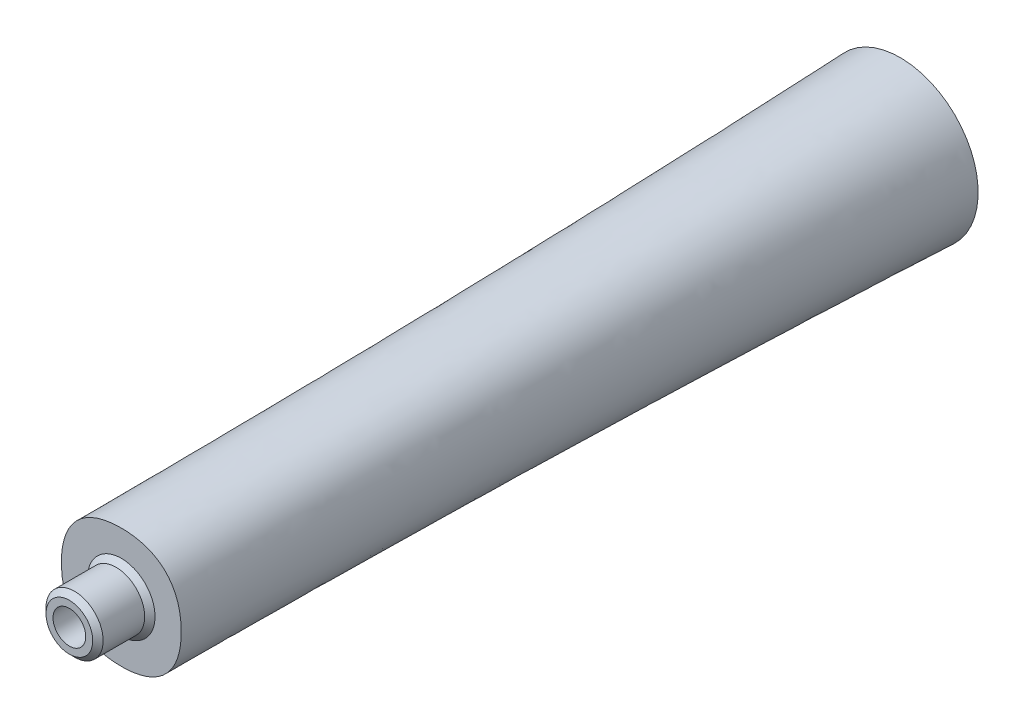
ISO-10303-21;
HEADER;
FILE_DESCRIPTION(('STEP AP214'),'2;1');
FILE_NAME('part.step','',(''),(''),'','','');
FILE_SCHEMA(('AUTOMOTIVE_DESIGN { 1 0 10303 214 1 1 1 1 }'));
ENDSEC;
DATA;
#1=APPLICATION_CONTEXT('core data for automotive mechanical design processes');
#2=APPLICATION_PROTOCOL_DEFINITION('international standard','automotive_design',2000,#1);
#3=PRODUCT_CONTEXT('',#1,'mechanical');
#4=PRODUCT('Part','Part','',(#3));
#5=PRODUCT_RELATED_PRODUCT_CATEGORY('part','',(#4));
#6=PRODUCT_DEFINITION_FORMATION('','',#4);
#7=PRODUCT_DEFINITION_CONTEXT('part definition',#1,'design');
#8=PRODUCT_DEFINITION('design','',#6,#7);
#9=PRODUCT_DEFINITION_SHAPE('','',#8);
#10=(LENGTH_UNIT() NAMED_UNIT(*) SI_UNIT(.MILLI.,.METRE.));
#11=(NAMED_UNIT(*) PLANE_ANGLE_UNIT() SI_UNIT($,.RADIAN.));
#12=(NAMED_UNIT(*) SI_UNIT($,.STERADIAN.) SOLID_ANGLE_UNIT());
#13=UNCERTAINTY_MEASURE_WITH_UNIT(LENGTH_MEASURE(1.E-05),#10,'distance_accuracy_value','');
#14=(GEOMETRIC_REPRESENTATION_CONTEXT(3) GLOBAL_UNCERTAINTY_ASSIGNED_CONTEXT((#13)) GLOBAL_UNIT_ASSIGNED_CONTEXT((#10,
#11,#12)) REPRESENTATION_CONTEXT('',''));
#15=CARTESIAN_POINT('',(0.,0.,0.));
#16=DIRECTION('',(0.,0.,1.));
#17=DIRECTION('',(1.,0.,0.));
#18=AXIS2_PLACEMENT_3D('',#15,#16,#17);
#19=CARTESIAN_POINT('',(0.,0.,150.));
#20=DIRECTION('',(0.,0.,-1.));
#21=DIRECTION('',(-1.,0.,0.));
#22=AXIS2_PLACEMENT_3D('',#19,#20,#21);
#23=PLANE('',#22);
#24=CARTESIAN_POINT('',(0.,0.,150.));
#25=DIRECTION('',(0.,0.,-1.));
#26=DIRECTION('',(-1.,0.,0.));
#27=AXIS2_PLACEMENT_3D('',#24,#25,#26);
#28=CIRCLE('',#27,6.50000000000001);
#29=CARTESIAN_POINT('',(-6.50000000000001,0.,150.));
#30=VERTEX_POINT('',#29);
#31=EDGE_CURVE('E124',#30,#30,#28,.T.);
#32=ORIENTED_EDGE('',*,*,#31,.T.);
#33=EDGE_LOOP('',(#32));
#34=FACE_BOUND('',#33,.T.);
#35=CARTESIAN_POINT('',(-11.541854565399,0.,149.999999997366));
#36=CARTESIAN_POINT('',(-11.5418536994029,-0.401355757927279,149.999999997418));
#37=CARTESIAN_POINT('',(-11.5293171598583,-0.802707549844226,149.999999999308));
#38=CARTESIAN_POINT('',(-11.4759797494714,-1.60374827617522,150.000000000692));
#39=CARTESIAN_POINT('',(-11.4351710584041,-2.00343671971828,150.000000000185));
#40=CARTESIAN_POINT('',(-11.3216394636897,-2.79775464109179,149.999999999815));
#41=CARTESIAN_POINT('',(-11.2489631262335,-3.19239063899266,149.999999999951));
#42=CARTESIAN_POINT('',(-11.0675723921283,-3.97326288959729,150.000000000049));
#43=CARTESIAN_POINT('',(-10.9588815423036,-4.3595044553448,150.000000000011));
#44=CARTESIAN_POINT('',(-10.7427202803528,-4.9960152801339,149.999999999993));
#45=CARTESIAN_POINT('',(-10.6461388384174,-5.25000013290062,149.999999999998));
#46=CARTESIAN_POINT('',(-10.4337811359734,-5.74984283685569,150.000000000002));
#47=CARTESIAN_POINT('',(-10.3180063908867,-5.99570132783038,150.000000000001));
#48=CARTESIAN_POINT('',(-10.0670053989865,-6.47705937535507,149.999999999999));
#49=CARTESIAN_POINT('',(-9.93179509497459,-6.7125672176856,150.));
#50=CARTESIAN_POINT('',(-9.64184809256927,-7.17122321615265,150.));
#51=CARTESIAN_POINT('',(-9.48711373000722,-7.39437284622081,150.));
#52=CARTESIAN_POINT('',(-9.15750136454443,-7.82742626969343,150.));
#53=CARTESIAN_POINT('',(-8.98251048976429,-8.03724465529183,150.));
#54=CARTESIAN_POINT('',(-8.70624921174298,-8.33924259631013,150.));
#55=CARTESIAN_POINT('',(-8.61186139999785,-8.43779142263712,150.));
#56=CARTESIAN_POINT('',(-8.41861810790369,-8.63045563928594,150.));
#57=CARTESIAN_POINT('',(-8.31976153520119,-8.72456993401321,150.));
#58=CARTESIAN_POINT('',(-8.01694953836434,-8.99991540051646,150.));
#59=CARTESIAN_POINT('',(-7.80665548691768,-9.17425435822067,150.));
#60=CARTESIAN_POINT('',(-7.37135617607085,-9.50359091828676,150.));
#61=CARTESIAN_POINT('',(-7.14634422384303,-9.65857962680361,150.));
#62=CARTESIAN_POINT('',(-6.69943566151898,-9.93904040360528,150.));
#63=CARTESIAN_POINT('',(-6.47834083793555,-10.0657944834204,150.));
#64=CARTESIAN_POINT('',(-6.02714425227574,-10.3021158197794,150.));
#65=CARTESIAN_POINT('',(-5.79704152776197,-10.4116812335259,150.));
#66=CARTESIAN_POINT('',(-5.32949709872402,-10.6139244558501,150.));
#67=CARTESIAN_POINT('',(-5.09205384947439,-10.706598681194,150.));
#68=CARTESIAN_POINT('',(-4.61139683146734,-10.8755182315322,150.));
#69=CARTESIAN_POINT('',(-4.36818243831409,-10.9517617697655,150.));
#70=CARTESIAN_POINT('',(-3.85608072140049,-11.0948547700045,150.));
#71=CARTESIAN_POINT('',(-3.58680439864019,-11.1603048950958,150.));
#72=CARTESIAN_POINT('',(-3.04460955998237,-11.2744817469932,150.));
#73=CARTESIAN_POINT('',(-2.7716890747401,-11.3231990169402,150.));
#74=CARTESIAN_POINT('',(-2.22348281409539,-11.4052379600946,150.));
#75=CARTESIAN_POINT('',(-1.94819632371092,-11.438554799978,150.));
#76=CARTESIAN_POINT('',(-1.39522105679997,-11.4911397562973,150.));
#77=CARTESIAN_POINT('',(-1.11752709620361,-11.5103524478534,150.));
#78=CARTESIAN_POINT('',(-0.561639275551755,-11.5356687296765,150.));
#79=CARTESIAN_POINT('',(-0.283445582040061,-11.5417760846317,150.));
#80=CARTESIAN_POINT('',(0.27291832299971,-11.5419316056286,150.));
#81=CARTESIAN_POINT('',(0.551088535015663,-11.5359802173951,150.));
#82=CARTESIAN_POINT('',(1.19691351920611,-11.5069535016099,150.));
#83=CARTESIAN_POINT('',(1.5643781536077,-11.4789574123874,150.));
#84=CARTESIAN_POINT('',(2.11335862067173,-11.4177369408435,150.));
#85=CARTESIAN_POINT('',(2.29597764410096,-11.3941266519661,150.));
#86=CARTESIAN_POINT('',(2.66026578396025,-11.3401093531148,150.));
#87=CARTESIAN_POINT('',(2.84193454474969,-11.3096999621338,150.));
#88=CARTESIAN_POINT('',(3.38325932982941,-11.2079976696009,150.));
#89=CARTESIAN_POINT('',(3.74103471936672,-11.126038003588,150.));
#90=CARTESIAN_POINT('',(4.27101276853864,-10.9793388933274,150.));
#91=CARTESIAN_POINT('',(4.44656941455521,-10.9264749427759,150.));
#92=CARTESIAN_POINT('',(4.79494128732353,-10.8123963566293,150.));
#93=CARTESIAN_POINT('',(4.96775680415604,-10.7511826113244,150.));
#94=CARTESIAN_POINT('',(5.38993427533975,-10.5895650277931,150.));
#95=CARTESIAN_POINT('',(5.6374193009443,-10.4841956906733,150.));
#96=CARTESIAN_POINT('',(6.12341250542991,-10.2544514992782,150.));
#97=CARTESIAN_POINT('',(6.36192097243637,-10.1300772556629,150.));
#98=CARTESIAN_POINT('',(6.82800416506739,-9.86205990721202,150.));
#99=CARTESIAN_POINT('',(7.05557508095503,-9.71841015350808,150.));
#100=CARTESIAN_POINT('',(7.4974461259936,-9.4121108784702,150.));
#101=CARTESIAN_POINT('',(7.71175147278949,-9.24946890079687,150.));
#102=CARTESIAN_POINT('',(8.12599163537684,-8.90497731547193,150.));
#103=CARTESIAN_POINT('',(8.3258575398975,-8.72304467129187,150.));
#104=CARTESIAN_POINT('',(8.70814352515308,-8.34169043576707,150.));
#105=CARTESIAN_POINT('',(8.8905635988201,-8.14226883733702,150.));
#106=CARTESIAN_POINT('',(9.23674385474077,-7.72802588603659,150.));
#107=CARTESIAN_POINT('',(9.40051264724978,-7.51321171428797,150.));
#108=CARTESIAN_POINT('',(9.70893085192531,-7.07015279729179,150.));
#109=CARTESIAN_POINT('',(9.85357159024528,-6.84190202639231,150.));
#110=CARTESIAN_POINT('',(10.1164781421454,-6.38634269968815,150.));
#111=CARTESIAN_POINT('',(10.2357208863338,-6.15959543283219,150.));
#112=CARTESIAN_POINT('',(10.4569568876952,-5.69783055025263,150.));
#113=CARTESIAN_POINT('',(10.5589483802222,-5.46281209142829,150.));
#114=CARTESIAN_POINT('',(10.746093058012,-4.98598753217331,150.));
#115=CARTESIAN_POINT('',(10.8312335848246,-4.74417648368212,150.));
#116=CARTESIAN_POINT('',(10.9853598858867,-4.25547375680911,150.));
#117=CARTESIAN_POINT('',(11.0543442917362,-4.00858164999423,150.));
#118=CARTESIAN_POINT('',(11.1855243746252,-3.47793919286741,150.));
#119=CARTESIAN_POINT('',(11.2455882293671,-3.19366391267622,150.));
#120=CARTESIAN_POINT('',(11.3480841507545,-2.62182048256758,150.));
#121=CARTESIAN_POINT('',(11.3905054022288,-2.3342504235514,150.));
#122=CARTESIAN_POINT('',(11.4592057307189,-1.75706364773313,150.));
#123=CARTESIAN_POINT('',(11.4854770915521,-1.46744601937061,150.));
#124=CARTESIAN_POINT('',(11.5138155244204,-1.03189790564804,150.));
#125=CARTESIAN_POINT('',(11.5214200732818,-0.886300436970029,150.));
#126=CARTESIAN_POINT('',(11.533061955762,-0.594958534543804,150.));
#127=CARTESIAN_POINT('',(11.5370992532269,-0.449214099321083,150.));
#128=CARTESIAN_POINT('',(11.5417747295487,-0.157730273853745,150.));
#129=CARTESIAN_POINT('',(11.5424142602128,-0.0119909046745823,150.));
#130=CARTESIAN_POINT('',(11.5403610855083,0.279460748718199,150.));
#131=CARTESIAN_POINT('',(11.5376684101048,0.425173033163593,150.));
#132=CARTESIAN_POINT('',(11.5243364586219,0.862094505077408,150.));
#133=CARTESIAN_POINT('',(11.5084445767624,1.15316341010471,150.));
#134=CARTESIAN_POINT('',(11.4571778167239,1.78609261947361,150.));
#135=CARTESIAN_POINT('',(11.4188251726858,2.12772037606876,150.));
#136=CARTESIAN_POINT('',(11.3185176534011,2.80751977078997,150.));
#137=CARTESIAN_POINT('',(11.2565641974387,3.14569161548904,150.));
#138=CARTESIAN_POINT('',(11.1067334330443,3.81490275391266,150.));
#139=CARTESIAN_POINT('',(11.0189655890046,4.14596595631763,150.));
#140=CARTESIAN_POINT('',(10.8658383274791,4.63574459366194,150.));
#141=CARTESIAN_POINT('',(10.8112199494759,4.79786011791878,150.));
#142=CARTESIAN_POINT('',(10.6945243358615,5.11941766533972,150.));
#143=CARTESIAN_POINT('',(10.6324459631435,5.27885927669496,150.));
#144=CARTESIAN_POINT('',(10.4639957180397,5.68253189543206,150.));
#145=CARTESIAN_POINT('',(10.3522096413007,5.92453324930647,150.));
#146=CARTESIAN_POINT('',(10.1098492399233,6.39894785918335,150.));
#147=CARTESIAN_POINT('',(9.97927532680361,6.63136132505039,150.));
#148=CARTESIAN_POINT('',(9.69919397361224,7.08469894019758,150.));
#149=CARTESIAN_POINT('',(9.54967556483482,7.30561632796521,150.));
#150=CARTESIAN_POINT('',(9.23212465099859,7.73363753372576,150.));
#151=CARTESIAN_POINT('',(9.06410076682816,7.94074771230781,150.));
#152=CARTESIAN_POINT('',(8.79848324532445,8.23989583016644,150.));
#153=CARTESIAN_POINT('',(8.70749661383106,8.33786554693269,150.));
#154=CARTESIAN_POINT('',(8.52119653991513,8.52959727617441,150.));
#155=CARTESIAN_POINT('',(8.42588318165068,8.62335937042083,150.));
#156=CARTESIAN_POINT('',(8.13375639123133,8.89806006473028,150.));
#157=CARTESIAN_POINT('',(7.9307188639717,9.07245516430253,150.));
#158=CARTESIAN_POINT('',(7.51031133305755,9.40264067152794,150.));
#159=CARTESIAN_POINT('',(7.292949803326,9.55844192842484,150.));
#160=CARTESIAN_POINT('',(6.84576339722231,9.85119968558504,150.));
#161=CARTESIAN_POINT('',(6.61593299105821,9.9881477278517,150.));
#162=CARTESIAN_POINT('',(6.15446671413528,10.2384694135765,150.));
#163=CARTESIAN_POINT('',(5.92319300005266,10.3525137270258,150.));
#164=CARTESIAN_POINT('',(5.45286012144287,10.563241642327,150.));
#165=CARTESIAN_POINT('',(5.21380012245186,10.6599233761337,150.));
#166=CARTESIAN_POINT('',(4.72925488053419,10.8364474130886,150.));
#167=CARTESIAN_POINT('',(4.48376246498554,10.9162699331389,150.));
#168=CARTESIAN_POINT('',(3.98817276363169,11.0599596309804,150.));
#169=CARTESIAN_POINT('',(3.73807517312787,11.1238257489234,150.));
#170=CARTESIAN_POINT('',(3.19309934271747,11.2460741856969,150.));
#171=CARTESIAN_POINT('',(2.89763140502402,11.3018198231188,150.));
#172=CARTESIAN_POINT('',(2.30368190943547,11.3950220202179,150.));
#173=CARTESIAN_POINT('',(2.00519853205604,11.4324667698637,150.));
#174=CARTESIAN_POINT('',(1.40644486124677,11.4906692941387,150.));
#175=CARTESIAN_POINT('',(1.10617360920646,11.5114171143019,150.));
#176=CARTESIAN_POINT('',(0.654957775512834,11.5310954925752,150.));
#177=CARTESIAN_POINT('',(0.504235538160645,11.5357464027898,150.));
#178=CARTESIAN_POINT('',(0.202721931225564,11.5413919372327,150.));
#179=CARTESIAN_POINT('',(0.0519305609101198,11.542386521778,150.));
#180=CARTESIAN_POINT('',(-0.400265113032265,11.5400270336634,150.));
#181=CARTESIAN_POINT('',(-0.701664376340691,11.5313370056312,150.));
#182=CARTESIAN_POINT('',(-1.30352120640034,11.4983198168705,150.));
#183=CARTESIAN_POINT('',(-1.6039790396715,11.4739975783707,150.));
#184=CARTESIAN_POINT('',(-2.22952224973743,11.405325473926,150.));
#185=CARTESIAN_POINT('',(-2.5544389746431,11.3593964592959,150.));
#186=CARTESIAN_POINT('',(-3.2003394714485,11.2450875624389,150.));
#187=CARTESIAN_POINT('',(-3.52132344195218,11.1767088188102,150.));
#188=CARTESIAN_POINT('',(-4.15584527363419,11.0154934741266,150.));
#189=CARTESIAN_POINT('',(-4.46940712680948,10.9227524629793,150.));
#190=CARTESIAN_POINT('',(-5.08731021384819,10.7103625054095,150.));
#191=CARTESIAN_POINT('',(-5.39165354277786,10.5907197257317,150.));
#192=CARTESIAN_POINT('',(-5.93082254939972,10.3490505408438,150.));
#193=CARTESIAN_POINT('',(-6.16781686510172,10.2318507637158,150.));
#194=CARTESIAN_POINT('',(-6.6317239090533,9.97890651786635,150.));
#195=CARTESIAN_POINT('',(-6.85863727011576,9.84316321536554,150.));
#196=CARTESIAN_POINT('',(-7.30039432872054,9.55315824389443,150.));
#197=CARTESIAN_POINT('',(-7.51523524618186,9.39889233492606,150.));
#198=CARTESIAN_POINT('',(-7.93077346940004,9.07229199407985,150.));
#199=CARTESIAN_POINT('',(-8.13147158321449,8.89995859590081,150.));
#200=CARTESIAN_POINT('',(-8.42059370564552,8.6284543387516,150.));
#201=CARTESIAN_POINT('',(-8.51508322550793,8.53566998385946,150.));
#202=CARTESIAN_POINT('',(-8.69981989992102,8.34596960586576,150.));
#203=CARTESIAN_POINT('',(-8.79006704406861,8.24905357263366,150.));
#204=CARTESIAN_POINT('',(-9.05423047488045,7.95245722105068,150.));
#205=CARTESIAN_POINT('',(-9.22160948494089,7.74689034948627,150.));
#206=CARTESIAN_POINT('',(-9.53810831145911,7.32206689758776,150.));
#207=CARTESIAN_POINT('',(-9.6872194802265,7.10280390732519,150.));
#208=CARTESIAN_POINT('',(-9.96680435941036,6.65271636976094,150.));
#209=CARTESIAN_POINT('',(-10.0972763746923,6.42189077347518,150.));
#210=CARTESIAN_POINT('',(-10.3653895098786,5.90057358318735,150.));
#211=CARTESIAN_POINT('',(-10.4986646064036,5.60782445674551,149.999999999999));
#212=CARTESIAN_POINT('',(-10.67854786503,5.16076657034955,150.));
#213=CARTESIAN_POINT('',(-10.7351815328833,5.01038910252547,150.000000000001));
#214=CARTESIAN_POINT('',(-10.8419151693467,4.70733072067654,149.999999999999));
#215=CARTESIAN_POINT('',(-10.8920151978562,4.55464982778344,149.999999999997));
#216=CARTESIAN_POINT('',(-11.0329216672749,4.09364819502358,150.000000000006));
#217=CARTESIAN_POINT('',(-11.114315705692,3.78241578160942,150.000000000033));
#218=CARTESIAN_POINT('',(-11.2541610859927,3.15499065004393,149.999999999967));
#219=CARTESIAN_POINT('',(-11.312614514823,2.83879838582165,149.999999999873));
#220=CARTESIAN_POINT('',(-11.4237408543973,2.10429186971091,150.000000000167));
#221=CARTESIAN_POINT('',(-11.4689423855298,1.68484494882285,150.000000000713));
#222=CARTESIAN_POINT('',(-11.5280113046448,0.843598233010171,149.999999999286));
#223=CARTESIAN_POINT('',(-11.5418554755005,0.421796926366122,149.999999997311));
#224=CARTESIAN_POINT('',(-11.541854565399,0.,149.999999997366));
#225=B_SPLINE_CURVE_WITH_KNOTS('',3,(#35,#36,#37,#38,#39,#40,#41,#42,#43,#44,#45,#46,#47,#48,
#49,#50,#51,#52,#53,#54,#55,#56,#57,#58,#59,#60,#61,#62,#63,#64,#65,#66,#67,#68,#69,#70,#71,#72,
#73,#74,#75,#76,#77,#78,#79,#80,#81,#82,#83,#84,#85,#86,#87,#88,#89,#90,#91,#92,#93,#94,#95,#96,
#97,#98,#99,#100,#101,#102,#103,#104,#105,#106,#107,#108,#109,#110,#111,#112,#113,#114,#115,
#116,#117,#118,#119,#120,#121,#122,#123,#124,#125,#126,#127,#128,#129,#130,#131,#132,#133,#134,
#135,#136,#137,#138,#139,#140,#141,#142,#143,#144,#145,#146,#147,#148,#149,#150,#151,#152,#153,
#154,#155,#156,#157,#158,#159,#160,#161,#162,#163,#164,#165,#166,#167,#168,#169,#170,#171,#172,
#173,#174,#175,#176,#177,#178,#179,#180,#181,#182,#183,#184,#185,#186,#187,#188,#189,#190,#191,
#192,#193,#194,#195,#196,#197,#198,#199,#200,#201,#202,#203,#204,#205,#206,#207,#208,#209,#210,
#211,#212,#213,#214,#215,#216,#217,#218,#219,#220,#221,#222,#223,#224),.UNSPECIFIED.,.T.,.F.,(4,
2,2,2,2,2,2,2,2,2,2,2,2,2,2,2,2,2,2,2,2,2,2,2,2,2,2,2,2,2,2,2,2,2,2,2,2,2,2,2,2,2,2,2,2,2,2,2,2,
2,2,2,2,2,2,2,2,2,2,2,2,2,2,2,2,2,2,2,2,2,2,2,2,2,2,2,2,2,2,2,2,2,2,2,2,2,2,2,2,2,2,2,2,2,4),
(0.,1.20381099343524,2.40795510031138,3.61034550027078,4.81195130561032,5.62642260415793,
6.44082962611149,7.25457237030319,8.06821785158514,8.88663767278015,9.2958871169127,
9.7052371456012,10.5235108736601,11.3421593263665,12.1059451391833,12.8698127816196,
13.6338422799682,14.3979548210967,15.228712448359,16.059938822884,16.8914258955337,
17.7261632121628,18.5606607068906,19.3951273568223,20.4997950619257,21.0520981738135,
21.6045950029089,22.7041684860749,23.2540284701402,23.8038298715833,24.6099664416323,
25.4160771145809,26.2224665644866,27.0285368012013,27.8382296157903,28.647922758412,
29.4572405826277,30.2669241524701,31.0347502169185,31.8026547755451,32.5711340129449,
33.3396783159075,34.210703401875,35.0822616545886,35.9542360021541,36.3915886998675,
36.8289458300709,37.2661289439571,37.7033081264752,38.5774413895769,39.6080129048051,
40.6385224542396,41.6647236859851,42.1777726219426,42.6908998599922,43.4897878110454,
44.2886582663452,45.0879933929453,45.8869577070263,46.2879498242811,46.6889341452762,
47.4907345400058,48.2920647842242,49.0937533606652,49.866611750852,50.6395532433556,
51.4133967500854,52.1872916430052,53.0886780003512,53.9906452798654,54.8931499015804,
55.3454938236671,55.7978426551325,56.7020201744825,57.6059131282147,58.5896397671476,
59.5733165214457,60.553189836354,61.5328387615768,62.3252389590696,63.1175893446501,
63.9101214536883,64.7026082441511,65.0997770986687,65.496946927068,66.2911194671754,
67.0856665144091,67.8802857756445,68.8437259308735,69.3256696663409,69.8076089831153,
70.771639758794,71.7355828145891,72.9997685577907,74.264890004108),.UNSPECIFIED.);
#226=CARTESIAN_POINT('',(-11.5418545654096,0.,150.));
#227=VERTEX_POINT('',#226);
#228=EDGE_CURVE('E188',#227,#227,#225,.T.);
#229=ORIENTED_EDGE('',*,*,#228,.T.);
#230=EDGE_LOOP('',(#229));
#231=FACE_BOUND('',#230,.T.);
#232=ADVANCED_FACE('F113',(#34,#231),#23,.F.);
#233=CARTESIAN_POINT('',(0.,0.,0.));
#234=DIRECTION('',(0.,0.,1.));
#235=DIRECTION('',(1.,0.,0.));
#236=AXIS2_PLACEMENT_3D('',#233,#234,#235);
#237=PLANE('',#236);
#238=CARTESIAN_POINT('',(0.,0.,0.));
#239=DIRECTION('',(0.,0.,1.));
#240=DIRECTION('',(1.,0.,0.));
#241=AXIS2_PLACEMENT_3D('',#238,#239,#240);
#242=CIRCLE('',#241,12.1);
#243=CARTESIAN_POINT('',(12.1,0.,0.));
#244=VERTEX_POINT('',#243);
#245=EDGE_CURVE('E120',#244,#244,#242,.T.);
#246=ORIENTED_EDGE('',*,*,#245,.T.);
#247=EDGE_LOOP('',(#246));
#248=FACE_BOUND('',#247,.T.);
#249=CARTESIAN_POINT('',(0.,0.,0.));
#250=DIRECTION('',(0.,0.,1.));
#251=DIRECTION('',(1.,0.,0.));
#252=AXIS2_PLACEMENT_3D('',#249,#250,#251);
#253=CIRCLE('',#252,15.);
#254=CARTESIAN_POINT('',(-15.,0.,0.));
#255=VERTEX_POINT('',#254);
#256=EDGE_CURVE('E145',#255,#255,#253,.T.);
#257=ORIENTED_EDGE('',*,*,#256,.F.);
#258=EDGE_LOOP('',(#257));
#259=FACE_BOUND('',#258,.T.);
#260=ADVANCED_FACE('F157',(#248,#259),#237,.F.);
#261=CARTESIAN_POINT('',(-15.,0.,0.));
#262=CARTESIAN_POINT('',(-11.4703442530879,0.,73.4161185565387));
#263=CARTESIAN_POINT('',(-10.63958843352,0.,146.522630678536));
#264=CARTESIAN_POINT('',(-12.5,0.,220.));
#265=CARTESIAN_POINT('',(-15.,-1.96349539571791,0.));
#266=CARTESIAN_POINT('',(-11.4703442530879,-1.85441231817803,73.4161185565387));
#267=CARTESIAN_POINT('',(-10.63958843352,-1.74532924063814,146.522630678536));
#268=CARTESIAN_POINT('',(-12.5,-1.63624616309826,220.));
#269=CARTESIAN_POINT('',(-14.2198461388777,-5.88984756492641,0.));
#270=CARTESIAN_POINT('',(-11.0705725748364,-5.22559350962199,73.4161185565386));
#271=CARTESIAN_POINT('',(-10.2828364472213,-4.89870194523564,146.522630678536));
#272=CARTESIAN_POINT('',(-11.8498717823981,-4.90820630410533,220.));
#273=CARTESIAN_POINT('',(-10.882974650403,-10.8829746504029,0.));
#274=CARTESIAN_POINT('',(-8.93020374081342,-8.93020374081315,73.4161185565387));
#275=CARTESIAN_POINT('',(-8.32688279489595,-8.3268827948957,146.522630678537));
#276=CARTESIAN_POINT('',(-9.06914554200247,-9.06914554200244,220.000000000001));
#277=CARTESIAN_POINT('',(-5.88984756492637,-14.2198461388777,0.));
#278=CARTESIAN_POINT('',(-5.225593509622,-11.0705725748361,73.4161185565382));
#279=CARTESIAN_POINT('',(-4.89870194523566,-10.2828364472209,146.522630678536));
#280=CARTESIAN_POINT('',(-4.90820630410531,-11.8498717823981,220.));
#281=CARTESIAN_POINT('',(-1.96349539571792,-15.,0.));
#282=CARTESIAN_POINT('',(-1.85441231817803,-11.4703442530875,73.4161185565383));
#283=CARTESIAN_POINT('',(-1.74532924063814,-10.6395884335195,146.522630678536));
#284=CARTESIAN_POINT('',(-1.63624616309826,-12.5,220.));
#285=CARTESIAN_POINT('',(1.96349539571791,-15.,0.));
#286=CARTESIAN_POINT('',(1.85441231817803,-11.4703442530875,73.4161185565383));
#287=CARTESIAN_POINT('',(1.74532924063814,-10.6395884335195,146.522630678536));
#288=CARTESIAN_POINT('',(1.63624616309826,-12.5,220.));
#289=CARTESIAN_POINT('',(5.88984756492637,-14.2198461388777,0.));
#290=CARTESIAN_POINT('',(5.22559350962201,-11.0705725748361,73.4161185565382));
#291=CARTESIAN_POINT('',(4.89870194523567,-10.2828364472209,146.522630678536));
#292=CARTESIAN_POINT('',(4.90820630410531,-11.8498717823981,220.));
#293=CARTESIAN_POINT('',(10.8829746504029,-10.8829746504029,0.));
#294=CARTESIAN_POINT('',(8.9302037408134,-8.93020374081318,73.4161185565382));
#295=CARTESIAN_POINT('',(8.32688279489594,-8.32688279489572,146.522630678536));
#296=CARTESIAN_POINT('',(9.06914554200246,-9.06914554200246,220.));
#297=CARTESIAN_POINT('',(14.2198461388777,-5.8898475649264,0.));
#298=CARTESIAN_POINT('',(11.0705725748364,-5.22559350962197,73.4161185565379));
#299=CARTESIAN_POINT('',(10.2828364472213,-4.89870194523562,146.522630678536));
#300=CARTESIAN_POINT('',(11.8498717823981,-4.90820630410532,220.));
#301=CARTESIAN_POINT('',(15.,-1.96349539571791,0.));
#302=CARTESIAN_POINT('',(11.4703442530879,-1.85441231817803,73.4161185565379));
#303=CARTESIAN_POINT('',(10.63958843352,-1.74532924063814,146.522630678536));
#304=CARTESIAN_POINT('',(12.5,-1.63624616309826,220.));
#305=CARTESIAN_POINT('',(15.,1.96349539571791,0.));
#306=CARTESIAN_POINT('',(11.4703442530879,1.85441231817803,73.4161185565379));
#307=CARTESIAN_POINT('',(10.63958843352,1.74532924063814,146.522630678536));
#308=CARTESIAN_POINT('',(12.5,1.63624616309826,220.));
#309=CARTESIAN_POINT('',(14.2198461388777,5.8898475649264,0.));
#310=CARTESIAN_POINT('',(11.0705725748364,5.22559350962203,73.4161185565376));
#311=CARTESIAN_POINT('',(10.2828364472213,4.89870194523567,146.522630678535));
#312=CARTESIAN_POINT('',(11.8498717823981,4.90820630410532,219.999999999999));
#313=CARTESIAN_POINT('',(10.8829746504029,10.8829746504029,0.));
#314=CARTESIAN_POINT('',(8.9302037408134,8.93020374081338,73.4161185565383));
#315=CARTESIAN_POINT('',(8.32688279489595,8.32688279489593,146.522630678537));
#316=CARTESIAN_POINT('',(9.06914554200247,9.06914554200246,220.000000000001));
#317=CARTESIAN_POINT('',(5.88984756492638,14.2198461388777,0.));
#318=CARTESIAN_POINT('',(5.22559350962201,11.0705725748364,73.4161185565376));
#319=CARTESIAN_POINT('',(4.89870194523566,10.2828364472213,146.522630678535));
#320=CARTESIAN_POINT('',(4.90820630410531,11.8498717823981,219.999999999999));
#321=CARTESIAN_POINT('',(1.96349539571791,15.,0.));
#322=CARTESIAN_POINT('',(1.85441231817802,11.4703442530879,73.4161185565379));
#323=CARTESIAN_POINT('',(1.74532924063814,10.63958843352,146.522630678536));
#324=CARTESIAN_POINT('',(1.63624616309826,12.5,220.));
#325=CARTESIAN_POINT('',(-1.96349539571791,15.,0.));
#326=CARTESIAN_POINT('',(-1.85441231817803,11.4703442530879,73.4161185565379));
#327=CARTESIAN_POINT('',(-1.74532924063815,10.63958843352,146.522630678536));
#328=CARTESIAN_POINT('',(-1.63624616309826,12.5,220.));
#329=CARTESIAN_POINT('',(-5.88984756492638,14.2198461388777,0.));
#330=CARTESIAN_POINT('',(-5.22559350962202,11.0705725748364,73.4161185565378));
#331=CARTESIAN_POINT('',(-4.89870194523568,10.2828364472213,146.522630678536));
#332=CARTESIAN_POINT('',(-4.90820630410532,11.8498717823981,219.999999999999));
#333=CARTESIAN_POINT('',(-10.882974650403,10.882974650403,0.));
#334=CARTESIAN_POINT('',(-8.93020374081341,8.93020374081341,73.4161185565386));
#335=CARTESIAN_POINT('',(-8.32688279489594,8.32688279489595,146.522630678537));
#336=CARTESIAN_POINT('',(-9.06914554200245,9.06914554200247,220.000000000001));
#337=CARTESIAN_POINT('',(-14.2198461388777,5.88984756492638,0.));
#338=CARTESIAN_POINT('',(-11.0705725748364,5.22559350962201,73.4161185565384));
#339=CARTESIAN_POINT('',(-10.2828364472213,4.89870194523566,146.522630678536));
#340=CARTESIAN_POINT('',(-11.8498717823981,4.90820630410531,219.999999999999));
#341=CARTESIAN_POINT('',(-15.,1.96349539571791,0.));
#342=CARTESIAN_POINT('',(-11.4703442530879,1.85441231817803,73.4161185565387));
#343=CARTESIAN_POINT('',(-10.63958843352,1.74532924063814,146.522630678536));
#344=CARTESIAN_POINT('',(-12.5,1.63624616309826,220.));
#345=CARTESIAN_POINT('',(-15.,0.,0.));
#346=CARTESIAN_POINT('',(-11.4703442530879,0.,73.4161185565387));
#347=CARTESIAN_POINT('',(-10.63958843352,0.,146.522630678536));
#348=CARTESIAN_POINT('',(-12.5,0.,220.));
#349=B_SPLINE_SURFACE_WITH_KNOTS('',3,3,((#261,#262,#263,#264),(#265,#266,#267,#268),(#269,#270,
#271,#272),(#273,#274,#275,#276),(#277,#278,#279,#280),(#281,#282,#283,#284),(#285,#286,#287,
#288),(#289,#290,#291,#292),(#293,#294,#295,#296),(#297,#298,#299,#300),(#301,#302,#303,#304),
(#305,#306,#307,#308),(#309,#310,#311,#312),(#313,#314,#315,#316),(#317,#318,#319,#320),(#321,
#322,#323,#324),(#325,#326,#327,#328),(#329,#330,#331,#332),(#333,#334,#335,#336),(#337,#338,
#339,#340),(#341,#342,#343,#344),(#345,#346,#347,#348)),.UNSPECIFIED.,.T.,.F.,.F.,(4,1,1,1,2,1,
1,1,2,1,1,1,2,1,1,1,4),(4,4),(0.,0.0625,0.125,0.1875,0.25,0.3125,0.375,0.4375,0.5,0.5625,0.625,
0.6875,0.75,0.8125,0.875,0.9375,1.),(0.,1.),.UNSPECIFIED.);
#350=CARTESIAN_POINT('',(-11.5418545654096,0.,150.));
#351=CARTESIAN_POINT('',(-11.5410648394304,0.,149.609380253542));
#352=CARTESIAN_POINT('',(-11.5403515786997,0.,149.218760352486));
#353=CARTESIAN_POINT('',(-11.5390780151156,0.,148.437529116933));
#354=CARTESIAN_POINT('',(-11.5385177088106,0.,148.04691778244));
#355=CARTESIAN_POINT('',(-11.5375500564013,0.,147.265703474129));
#356=CARTESIAN_POINT('',(-11.5371427069492,0.,146.875100500315));
#357=CARTESIAN_POINT('',(-11.536480970458,0.,146.093902707482));
#358=CARTESIAN_POINT('',(-11.5362265801748,0.,145.703307888466));
#359=CARTESIAN_POINT('',(-11.5358707642636,0.,144.922126199348));
#360=CARTESIAN_POINT('',(-11.5357693354953,0.,144.531539329249));
#361=CARTESIAN_POINT('',(-11.5357194448477,0.,143.750373332084));
#362=CARTESIAN_POINT('',(-11.5357709799322,0.,143.359794205019));
#363=CARTESIAN_POINT('',(-11.5360270192262,0.,142.578643488045));
#364=CARTESIAN_POINT('',(-11.5362315205034,0.,142.188071898134));
#365=CARTESIAN_POINT('',(-11.5367934944184,0.,141.406936049588));
#366=CARTESIAN_POINT('',(-11.5371509642279,0.,141.016371790949));
#367=CARTESIAN_POINT('',(-11.538018877443,0.,140.235250399067));
#368=CARTESIAN_POINT('',(-11.5385293181243,0.,139.844693265821));
#369=CARTESIAN_POINT('',(-11.5397031753187,0.,139.063585918841));
#370=CARTESIAN_POINT('',(-11.5403665892114,0.,138.673035705104));
#371=CARTESIAN_POINT('',(-11.5418463950641,0.,137.891941991264));
#372=CARTESIAN_POINT('',(-11.5426627845077,0.,137.501398491156));
#373=CARTESIAN_POINT('',(-11.5444485436979,0.,136.720317998692));
#374=CARTESIAN_POINT('',(-11.5454179110321,0.,136.329781006332));
#375=CARTESIAN_POINT('',(-11.5475096282388,0.,135.548713323482));
#376=CARTESIAN_POINT('',(-11.5486319758031,0.,135.158182632988));
#377=CARTESIAN_POINT('',(-11.5510296557056,0.,134.37712734799));
#378=CARTESIAN_POINT('',(-11.5523049858396,0.,133.98660275348));
#379=CARTESIAN_POINT('',(-11.5550086331169,0.,133.205559454572));
#380=CARTESIAN_POINT('',(-11.5564369481601,0.,132.815040750166));
#381=CARTESIAN_POINT('',(-11.5594465674914,0.,132.034009025583));
#382=CARTESIAN_POINT('',(-11.5610278697834,0.,131.643496005399));
#383=CARTESIAN_POINT('',(-11.5643434658478,0.,130.86247544338));
#384=CARTESIAN_POINT('',(-11.5660777577282,0.,130.471967901537));
#385=CARTESIAN_POINT('',(-11.5696993352048,0.,129.690958090319));
#386=CARTESIAN_POINT('',(-11.5715866190132,0.,129.300455820936));
#387=CARTESIAN_POINT('',(-11.5755141825812,0.,128.519456348756));
#388=CARTESIAN_POINT('',(-11.577554460657,0.,128.128959145951));
#389=CARTESIAN_POINT('',(-11.5817880149954,0.,127.347969601046));
#390=CARTESIAN_POINT('',(-11.5839812896784,0.,126.957477258939));
#391=CARTESIAN_POINT('',(-11.5885208394664,0.,126.176497229547));
#392=CARTESIAN_POINT('',(-11.590867113096,0.,125.786009542255));
#393=CARTESIAN_POINT('',(-11.5957126630127,0.,125.005038616614));
#394=CARTESIAN_POINT('',(-11.5982119379285,0.,124.614555378256));
#395=CARTESIAN_POINT('',(-11.6033634926531,0.,123.833593144602));
#396=CARTESIAN_POINT('',(-11.6060157711947,0.,123.443114149298));
#397=CARTESIAN_POINT('',(-11.6114733354063,0.,122.662160195869));
#398=CARTESIAN_POINT('',(-11.6142786199132,0.,122.271685237737));
#399=CARTESIAN_POINT('',(-11.6200421982908,0.,121.49073915277));
#400=CARTESIAN_POINT('',(-11.6230004911026,0.,121.100268025928));
#401=CARTESIAN_POINT('',(-11.6290700883255,0.,120.319329397661));
#402=CARTESIAN_POINT('',(-11.6321813917818,0.,119.928861896228));
#403=CARTESIAN_POINT('',(-11.638557012529,0.,119.147930312898));
#404=CARTESIAN_POINT('',(-11.6418213289693,0.,118.757466230994));
#405=CARTESIAN_POINT('',(-11.6485029779199,0.,117.976541280838));
#406=CARTESIAN_POINT('',(-11.6519203096839,0.,117.58608041258));
#407=CARTESIAN_POINT('',(-11.6589079915171,0.,116.805161683835));
#408=CARTESIAN_POINT('',(-11.6624783409442,0.,116.414703823343));
#409=CARTESIAN_POINT('',(-11.6697720603391,0.,115.633790904247));
#410=CARTESIAN_POINT('',(-11.6734954297689,0.,115.243335845639));
#411=CARTESIAN_POINT('',(-11.6810951914046,0.,114.46242832443));
#412=CARTESIAN_POINT('',(-11.6849715831768,0.,114.071975861825));
#413=CARTESIAN_POINT('',(-11.6928773917324,0.,113.291073326739));
#414=CARTESIAN_POINT('',(-11.6969068081864,0.,112.900623254255));
#415=CARTESIAN_POINT('',(-11.7051186683411,0.,112.11972529353));
#416=CARTESIAN_POINT('',(-11.7093011118165,0.,111.729277405287));
#417=CARTESIAN_POINT('',(-11.7178190282494,0.,110.94838360716));
#418=CARTESIAN_POINT('',(-11.7221545010858,0.,110.557937697275));
#419=CARTESIAN_POINT('',(-11.730978478476,0.,109.777047649984));
#420=CARTESIAN_POINT('',(-11.7354669830129,0.,109.386603512577));
#421=CARTESIAN_POINT('',(-11.7445970260395,0.,108.605716804359));
#422=CARTESIAN_POINT('',(-11.7492385646165,0.,108.215274233549));
#423=CARTESIAN_POINT('',(-11.7586746779587,0.,107.43439045264));
#424=CARTESIAN_POINT('',(-11.7634692529153,0.,107.043949242545));
#425=CARTESIAN_POINT('',(-11.7732114412522,0.,106.263067977185));
#426=CARTESIAN_POINT('',(-11.778159054928,0.,105.872627921923));
#427=CARTESIAN_POINT('',(-11.7882073229387,0.,105.091748760347));
#428=CARTESIAN_POINT('',(-11.7933079776733,0.,104.701309654038));
#429=CARTESIAN_POINT('',(-11.8036623300369,0.,103.920432184485));
#430=CARTESIAN_POINT('',(-11.8089160281698,0.,103.529993821247));
#431=CARTESIAN_POINT('',(-11.8195764695654,0.,102.749117631953));
#432=CARTESIAN_POINT('',(-11.8249832134363,0.,102.358679805906));
#433=CARTESIAN_POINT('',(-11.835949748543,0.,101.577804485109));
#434=CARTESIAN_POINT('',(-11.8415095404913,0.,101.187366990369));
#435=CARTESIAN_POINT('',(-11.8527821739883,0.,100.406492126307));
#436=CARTESIAN_POINT('',(-11.8584950163536,0.,100.016054756995));
#437=CARTESIAN_POINT('',(-11.87007375292,0.,99.2351799379036));
#438=CARTESIAN_POINT('',(-11.8759396480418,0.,98.8447424881379));
#439=CARTESIAN_POINT('',(-11.8878244923567,0.,98.0638673022555));
#440=CARTESIAN_POINT('',(-11.8938434425747,0.,97.6734295661546));
#441=CARTESIAN_POINT('',(-11.9060343993173,0.,96.8925536017184));
#442=CARTESIAN_POINT('',(-11.9122064069709,0.,96.5021153734009));
#443=CARTESIAN_POINT('',(-11.9247034808202,0.,95.7212382186483));
#444=CARTESIAN_POINT('',(-11.931028548249,0.,95.330799292233));
#445=CARTESIAN_POINT('',(-11.9438317438842,0.,94.5499205354013));
#446=CARTESIAN_POINT('',(-11.9503098734278,0.,94.1594807050068));
#447=CARTESIAN_POINT('',(-11.963419195528,0.,93.3785999343334));
#448=CARTESIAN_POINT('',(-11.970050389526,0.,92.9881589940785));
#449=CARTESIAN_POINT('',(-11.9834658427702,0.,92.2072757978006));
#450=CARTESIAN_POINT('',(-11.9902501035621,0.,91.816833541804));
#451=CARTESIAN_POINT('',(-12.0039716926296,0.,91.035947508159));
#452=CARTESIAN_POINT('',(-12.0109090225549,0.,90.6455037305395));
#453=CARTESIAN_POINT('',(-12.0249367521247,0.,89.8646144477647));
#454=CARTESIAN_POINT('',(-12.032027153523,0.,89.4741689426409));
#455=CARTESIAN_POINT('',(-12.0463610282743,0.,88.6932759989736));
#456=CARTESIAN_POINT('',(-12.0536045034851,0.,88.3028285604642));
#457=CARTESIAN_POINT('',(-12.068244528097,0.,87.5219315441418));
#458=CARTESIAN_POINT('',(-12.0756410794599,0.,87.1314819663656));
#459=CARTESIAN_POINT('',(-12.0905872586115,0.,86.3505804656254));
#460=CARTESIAN_POINT('',(-12.0981368884661,0.,85.960128542701));
#461=CARTESIAN_POINT('',(-12.1133892268365,0.,85.1792221457804));
#462=CARTESIAN_POINT('',(-12.1210919375223,0.,84.7887676718265));
#463=CARTESIAN_POINT('',(-12.1366504397906,0.,84.0078559669628));
#464=CARTESIAN_POINT('',(-12.1445062336472,0.,83.6173987360982));
#465=CARTESIAN_POINT('',(-12.1603709044926,0.,82.8364813115287));
#466=CARTESIAN_POINT('',(-12.1683797838594,0.,82.4460211178721));
#467=CARTESIAN_POINT('',(-12.184550627961,0.,81.6650975618341));
#468=CARTESIAN_POINT('',(-12.1927125951777,0.,81.2746341995042));
#469=CARTESIAN_POINT('',(-12.2091896172145,0.,80.4937041002351));
#470=CARTESIAN_POINT('',(-12.2175046746206,0.,80.1032373633505));
#471=CARTESIAN_POINT('',(-12.2342878792719,0.,79.3223003090877));
#472=CARTESIAN_POINT('',(-12.2427560292069,0.,78.9318299917672));
#473=CARTESIAN_POINT('',(-12.2598454211517,0.,78.1508855707479));
#474=CARTESIAN_POINT('',(-12.2684666659553,0.,77.7604114671102));
#475=CARTESIAN_POINT('',(-12.2858622498727,0.,76.9794592675717));
#476=CARTESIAN_POINT('',(-12.2946365918843,0.,76.5889811717356));
#477=CARTESIAN_POINT('',(-12.3123383724535,0.,75.8080207819153));
#478=CARTESIAN_POINT('',(-12.3212658140127,0.,75.4175384879994));
#479=CARTESIAN_POINT('',(-12.3392737959127,0.,74.6365694961347));
#480=CARTESIAN_POINT('',(-12.3483543393591,0.,74.2460827982576));
#481=CARTESIAN_POINT('',(-12.3666685272691,0.,73.4651047925859));
#482=CARTESIAN_POINT('',(-12.3759021749421,0.,73.0746134848664));
#483=CARTESIAN_POINT('',(-12.3945225735413,0.,72.2936260536249));
#484=CARTESIAN_POINT('',(-12.4039093277806,0.,71.9031299301817));
#485=CARTESIAN_POINT('',(-12.4228359417479,0.,71.1221326616077));
#486=CARTESIAN_POINT('',(-12.432375804893,0.,70.7316315165596));
#487=CARTESIAN_POINT('',(-12.4516086389077,0.,69.9506239988905));
#488=CARTESIAN_POINT('',(-12.4613016132981,0.,69.5601176263562));
#489=CARTESIAN_POINT('',(-12.4808406720392,0.,68.7790994478293));
#490=CARTESIAN_POINT('',(-12.4906867600145,0.,68.3885876419274));
#491=CARTESIAN_POINT('',(-12.5105320481612,0.,67.60755839078));
#492=CARTESIAN_POINT('',(-12.5205312520609,0.,67.2170409456293));
#493=CARTESIAN_POINT('',(-12.5406827742923,0.,66.4360002100988));
#494=CARTESIAN_POINT('',(-12.550835096456,0.,66.045476919818));
#495=CARTESIAN_POINT('',(-12.5712928574512,0.,65.2644242881417));
#496=CARTESIAN_POINT('',(-12.5815983002183,0.,64.8738949468494));
#497=CARTESIAN_POINT('',(-12.6023623046565,0.,64.0928300072647));
#498=CARTESIAN_POINT('',(-12.6128208703667,0.,63.7022944090797));
#499=CARTESIAN_POINT('',(-12.6338911229268,0.,62.9212167498239));
#500=CARTESIAN_POINT('',(-12.6445028139196,0.,62.5306746888648));
#501=CARTESIAN_POINT('',(-12.6658793192809,0.,61.7495838981752));
#502=CARTESIAN_POINT('',(-12.6766441378959,0.,61.3590351685609));
#503=CARTESIAN_POINT('',(-12.6983269007375,0.,60.5779308346748));
#504=CARTESIAN_POINT('',(-12.709244849314,0.,60.1873752305238));
#505=CARTESIAN_POINT('',(-12.731233874315,0.,59.4062569416786));
#506=CARTESIAN_POINT('',(-12.7423049551928,0.,59.0156942571098));
#507=CARTESIAN_POINT('',(-12.7646002470323,0.,58.2345616015428));
#508=CARTESIAN_POINT('',(-12.7758244625508,0.,57.8439916306747));
#509=CARTESIAN_POINT('',(-12.7984260259079,0.,57.0628441966233));
#510=CARTESIAN_POINT('',(-12.8098033784068,0.,56.6722667335748));
#511=CARTESIAN_POINT('',(-12.8327112179606,0.,55.8911041092762));
#512=CARTESIAN_POINT('',(-12.8442417097793,0.,55.5005189481659));
#513=CARTESIAN_POINT('',(-12.8674558302089,0.,54.7193407218576));
#514=CARTESIAN_POINT('',(-12.879139463687,0.,54.3287476568042));
#515=CARTESIAN_POINT('',(-12.9026598696716,0.,53.5475534167234));
#516=CARTESIAN_POINT('',(-12.9144966471486,0.,53.1569522418457));
#517=CARTESIAN_POINT('',(-12.9383233433672,0.,52.3757415762297));
#518=CARTESIAN_POINT('',(-12.9503132671827,0.,51.9851320856463));
#519=CARTESIAN_POINT('',(-12.9744462583145,0.,51.2039045827326));
#520=CARTESIAN_POINT('',(-12.9865893308079,0.,50.8132865705622));
#521=CARTESIAN_POINT('',(-13.011028621532,0.,50.0320418185881));
#522=CARTESIAN_POINT('',(-13.023324845043,0.,49.6414150789494));
#523=CARTESIAN_POINT('',(-13.0480704400386,0.,48.8601526661522));
#524=CARTESIAN_POINT('',(-13.0605198169066,0.,48.469516993164));
#525=CARTESIAN_POINT('',(-13.0855717208526,0.,47.6882365077809));
#526=CARTESIAN_POINT('',(-13.0981742534173,0.,47.2975916955619));
#527=CARTESIAN_POINT('',(-13.123532470993,0.,46.5162927258304));
#528=CARTESIAN_POINT('',(-13.1362881615938,0.,46.1256385684992));
#529=CARTESIAN_POINT('',(-13.1619526974782,0.,45.3443207026566));
#530=CARTESIAN_POINT('',(-13.1748615484547,0.,44.953656994332));
#531=CARTESIAN_POINT('',(-13.200832407327,0.,44.1723198206155));
#532=CARTESIAN_POINT('',(-13.2138944210187,0.,43.7816463554162));
#533=CARTESIAN_POINT('',(-13.2401716075579,0.,43.0002894620633));
#534=CARTESIAN_POINT('',(-13.2533867863044,0.,42.609606034108));
#535=CARTESIAN_POINT('',(-13.2799703051897,0.,41.8282290093559));
#536=CARTESIAN_POINT('',(-13.2933386513305,0.,41.4375354127633));
#537=CARTESIAN_POINT('',(-13.320228507241,0.,40.6561378448494));
#538=CARTESIAN_POINT('',(-13.3337500231156,0.,40.2654338737382));
#539=CARTESIAN_POINT('',(-13.3609462207304,0.,39.4840153508999));
#540=CARTESIAN_POINT('',(-13.3746209086783,0.,39.0933007993888));
#541=CARTESIAN_POINT('',(-13.4021234526765,0.,38.3118609098633));
#542=CARTESIAN_POINT('',(-13.4159513150374,0.,37.921135572071));
#543=CARTESIAN_POINT('',(-13.4437602100981,0.,37.1396739040957));
#544=CARTESIAN_POINT('',(-13.4577412492114,0.,36.7489375741409));
#545=CARTESIAN_POINT('',(-13.4858565000138,0.,35.9674537159531));
#546=CARTESIAN_POINT('',(-13.499990718219,0.,35.5767061879546));
#547=CARTESIAN_POINT('',(-13.5284123294422,0.,34.7951997277917));
#548=CARTESIAN_POINT('',(-13.5426997290789,0.,34.404440795868));
#549=CARTESIAN_POINT('',(-13.5714277054019,0.,33.6229113219673));
#550=CARTESIAN_POINT('',(-13.5858682888097,0.,33.2321407802373));
#551=CARTESIAN_POINT('',(-13.6149026349116,0.,32.4505878808361));
#552=CARTESIAN_POINT('',(-13.6294964044299,0.,32.0598055234184));
#553=CARTESIAN_POINT('',(-13.65883712499,0.,31.278228786754));
#554=CARTESIAN_POINT('',(-13.6735840829584,0.,30.8874344077674));
#555=CARTESIAN_POINT('',(-13.7032311826556,0.,30.1058334220772));
#556=CARTESIAN_POINT('',(-13.7181313314137,0.,29.7150268156403));
#557=CARTESIAN_POINT('',(-13.7480848149272,0.,28.9334011691617));
#558=CARTESIAN_POINT('',(-13.7631381568144,0.,28.5425821293932));
#559=CARTESIAN_POINT('',(-13.7933980288234,0.,27.7609314103634));
#560=CARTESIAN_POINT('',(-13.8086045661792,0.,27.3700997313821));
#561=CARTESIAN_POINT('',(-13.8391708313627,0.,26.5884235280385));
#562=CARTESIAN_POINT('',(-13.8545305665268,0.,26.197579003963));
#563=CARTESIAN_POINT('',(-13.8854032295639,0.,25.4158769045429));
#564=CARTESIAN_POINT('',(-13.9009161648757,0.,25.025019329492));
#565=CARTESIAN_POINT('',(-13.9320952304456,0.,24.2432909222328));
#566=CARTESIAN_POINT('',(-13.9477613682447,0.,23.8524200903251));
#567=CARTESIAN_POINT('',(-13.9792468410264,0.,23.070664963464));
#568=CARTESIAN_POINT('',(-13.9950661836523,0.,22.6797806688184));
#569=CARTESIAN_POINT('',(-14.026858068325,0.,21.8979984105928));
#570=CARTESIAN_POINT('',(-14.0428306181172,0.,21.5071004473278));
#571=CARTESIAN_POINT('',(-14.07492891936,0.,20.725290645975));
#572=CARTESIAN_POINT('',(-14.091054678658,0.,20.3343788082094));
#573=CARTESIAN_POINT('',(-14.12345940115,0.,19.5525410519668));
#574=CARTESIAN_POINT('',(-14.1397383722934,0.,19.1616151338193));
#575=CARTESIAN_POINT('',(-14.1724495207137,0.,18.3797490109242));
#576=CARTESIAN_POINT('',(-14.188881706042,0.,17.9888088065135));
#577=CARTESIAN_POINT('',(-14.2218992850697,0.,17.2069139052032));
#578=CARTESIAN_POINT('',(-14.2384846869224,0.,16.8159592086479));
#579=CARTESIAN_POINT('',(-14.2718087012366,0.,16.0340351171598));
#580=CARTESIAN_POINT('',(-14.2885473219533,0.,15.6430657225787));
#581=CARTESIAN_POINT('',(-14.3221777762331,0.,14.8611120291501));
#582=CARTESIAN_POINT('',(-14.3390696181533,0.,14.4701277306619));
#583=CARTESIAN_POINT('',(-14.3730065170779,0.,13.6881440235301));
#584=CARTESIAN_POINT('',(-14.3900515825411,0.,13.2971446152535));
#585=CARTESIAN_POINT('',(-14.4242949307895,0.,12.5151304826559));
#586=CARTESIAN_POINT('',(-14.4414932221352,0.,12.1241157587096));
#587=CARTESIAN_POINT('',(-14.4760430243865,0.,11.3420707888834));
#588=CARTESIAN_POINT('',(-14.4933945439543,0.,10.9510405433861));
#589=CARTESIAN_POINT('',(-14.5282508048877,0.,10.1689643245688));
#590=CARTESIAN_POINT('',(-14.5457555550171,0.,9.77791835163921));
#591=CARTESIAN_POINT('',(-14.5809182793117,0.,8.99581047206796));
#592=CARTESIAN_POINT('',(-14.5985762623421,0.,8.60474856582483));
#593=CARTESIAN_POINT('',(-14.634045454677,0.,7.82260861373705));
#594=CARTESIAN_POINT('',(-14.651856672948,0.,7.43153056829902));
#595=CARTESIAN_POINT('',(-14.6876323380023,0.,6.64935813193205));
#596=CARTESIAN_POINT('',(-14.7055967938536,0.,6.25826374141786));
#597=CARTESIAN_POINT('',(-14.7416789363062,0.,5.47605840900898));
#598=CARTESIAN_POINT('',(-14.7597966320768,0.,5.08494746753726));
#599=CARTESIAN_POINT('',(-14.7961852566079,0.,4.30270882732398));
#600=CARTESIAN_POINT('',(-14.814456194639,0.,3.91158112901368));
#601=CARTESIAN_POINT('',(-14.8511513059232,0.,3.12930876923266));
#602=CARTESIAN_POINT('',(-14.8695754885483,0.,2.73816410820155));
#603=CARTESIAN_POINT('',(-14.9065770912814,0.,1.95585761709265));
#604=CARTESIAN_POINT('',(-14.9251545208624,0.,1.56469578746291));
#605=CARTESIAN_POINT('',(-14.962462619662,0.,0.782354753253977));
#606=CARTESIAN_POINT('',(-14.9811932984545,0.,0.391175549131355));
#607=CARTESIAN_POINT('',(-15.,0.,0.));
#608=B_SPLINE_CURVE_WITH_KNOTS('',3,(#350,#351,#352,#353,#354,#355,#356,#357,#358,#359,#360,
#361,#362,#363,#364,#365,#366,#367,#368,#369,#370,#371,#372,#373,#374,#375,#376,#377,#378,#379,
#380,#381,#382,#383,#384,#385,#386,#387,#388,#389,#390,#391,#392,#393,#394,#395,#396,#397,#398,
#399,#400,#401,#402,#403,#404,#405,#406,#407,#408,#409,#410,#411,#412,#413,#414,#415,#416,#417,
#418,#419,#420,#421,#422,#423,#424,#425,#426,#427,#428,#429,#430,#431,#432,#433,#434,#435,#436,
#437,#438,#439,#440,#441,#442,#443,#444,#445,#446,#447,#448,#449,#450,#451,#452,#453,#454,#455,
#456,#457,#458,#459,#460,#461,#462,#463,#464,#465,#466,#467,#468,#469,#470,#471,#472,#473,#474,
#475,#476,#477,#478,#479,#480,#481,#482,#483,#484,#485,#486,#487,#488,#489,#490,#491,#492,#493,
#494,#495,#496,#497,#498,#499,#500,#501,#502,#503,#504,#505,#506,#507,#508,#509,#510,#511,#512,
#513,#514,#515,#516,#517,#518,#519,#520,#521,#522,#523,#524,#525,#526,#527,#528,#529,#530,#531,
#532,#533,#534,#535,#536,#537,#538,#539,#540,#541,#542,#543,#544,#545,#546,#547,#548,#549,#550,
#551,#552,#553,#554,#555,#556,#557,#558,#559,#560,#561,#562,#563,#564,#565,#566,#567,#568,#569,
#570,#571,#572,#573,#574,#575,#576,#577,#578,#579,#580,#581,#582,#583,#584,#585,#586,#587,#588,
#589,#590,#591,#592,#593,#594,#595,#596,#597,#598,#599,#600,#601,#602,#603,#604,#605,#606,#607),
.UNSPECIFIED.,.F.,.F.,(4,2,2,2,2,2,2,2,2,2,2,2,2,2,2,2,2,2,2,2,2,2,2,2,2,2,2,2,2,2,2,2,2,2,2,2,
2,2,2,2,2,2,2,2,2,2,2,2,2,2,2,2,2,2,2,2,2,2,2,2,2,2,2,2,2,2,2,2,2,2,2,2,2,2,2,2,2,2,2,2,2,2,2,2,
2,2,2,2,2,2,2,2,2,2,2,2,2,2,2,2,2,2,2,2,2,2,2,2,2,2,2,2,2,2,2,2,2,2,2,2,2,2,2,2,2,2,2,2,4),(0.,
1.17186162681001,2.34369680593004,3.51550633464744,4.68729101027052,5.85905163012781,
7.03078899156762,8.20250389195719,9.3741971286821,10.5458694991456,11.717521800768,
12.889154830986,14.0607693872522,15.232366267034,16.4039462678135,17.5755101870863,
18.7470588223616,19.9185929711607,21.0901134310169,22.2616209994745,23.4331164740887,
24.6046006524244,25.7760743320554,26.9475383105647,28.1189933855429,29.2904403545877,
30.4618800153038,31.6333131653017,32.8047406021972,33.9761631236108,35.1475815271671,
36.3189966104938,37.4904091712217,38.6618200069834,39.833229915413,41.0046396941452,
42.1760501408151,43.3474620530571,44.5188762285044,45.6902934647882,46.8617145595374,
48.0331403103778,49.2045715149312,50.3760089708151,51.5474534756416,52.7189058270175,
53.8903668225429,55.0618372598107,56.2333179364063,57.4048096499068,58.57631319788,
59.7478293778843,60.9193589874676,62.0909028241668,63.2624616855074,64.4340363690023,
65.6056276721517,66.7772363924423,67.9488633273462,69.120509274321,70.2921750308086,
71.4638613942346,72.635569162008,73.8072991315201,74.9790521001443,76.1508288652351,
77.3226302241274,78.4944569741363,79.6663099125561,80.8381898366595,82.0100975436974,
83.1820338308981,84.3539994954663,85.5259953345829,86.6980221454041,87.8700807250609,
89.0421718706584,90.2142963792752,91.3864550479625,92.5586486737437,93.7308780536137,
94.9031439845385,96.0754472634539,97.2477886872656,98.420169052848,99.592589157044,
100.765049796664,101.937551768485,103.110095869251,104.282682895672,105.455313644421,
106.627988912138,107.800709495426,108.97347619085,110.146289794939,111.319151104182,
112.492060915031,113.665020023898,114.838029227155,116.011089321133,117.184201102122,
118.357365366369,119.530582910079,120.703854529415,121.877181020495,123.050563179391,
124.224001802133,125.397497684702,126.571051623035,127.74466441302,128.9183368505,
130.092069731266,131.265863851062,132.439720005583,133.613638990474,134.787621601326,
135.961668633681,137.13578088303,138.309959144809,139.4842042144,140.658516887134,
141.832897958285,143.007348223072,144.181868476658,145.356459514151,146.5311221306,
147.705857120997,148.880665280275,150.055547403309),.UNSPECIFIED.);
#609=EDGE_CURVE('BSEAM167',#227,#255,#608,.T.);
#610=ORIENTED_EDGE('',*,*,#228,.F.);
#611=ORIENTED_EDGE('',*,*,#256,.T.);
#612=ORIENTED_EDGE('',*,*,#609,.T.);
#613=ORIENTED_EDGE('',*,*,#609,.F.);
#614=EDGE_LOOP('',(#610,#612,#611,#613));
#615=FACE_BOUND('',#614,.T.);
#616=ADVANCED_FACE('F167',(#615),#349,.T.);
#617=CARTESIAN_POINT('',(0.,0.,80.));
#618=DIRECTION('',(0.,0.,-1.));
#619=DIRECTION('',(-1.,0.,0.));
#620=AXIS2_PLACEMENT_3D('',#617,#618,#619);
#621=CYLINDRICAL_SURFACE('',#620,10.1);
#622=CARTESIAN_POINT('',(0.,0.,2.00000000000003));
#623=DIRECTION('',(0.,0.,1.));
#624=DIRECTION('',(1.,0.,0.));
#625=AXIS2_PLACEMENT_3D('',#622,#623,#624);
#626=CIRCLE('',#625,10.1);
#627=CARTESIAN_POINT('',(10.1,0.,2.00000000000003));
#628=VERTEX_POINT('',#627);
#629=EDGE_CURVE('E12',#628,#628,#626,.F.);
#630=ORIENTED_EDGE('',*,*,#629,.T.);
#631=EDGE_LOOP('',(#630));
#632=FACE_BOUND('',#631,.T.);
#633=CARTESIAN_POINT('',(0.,0.,77.9999999999999));
#634=DIRECTION('',(0.,0.,1.));
#635=DIRECTION('',(1.,0.,0.));
#636=AXIS2_PLACEMENT_3D('',#633,#634,#635);
#637=CIRCLE('',#636,10.1);
#638=CARTESIAN_POINT('',(10.1,0.,77.9999999999999));
#639=VERTEX_POINT('',#638);
#640=EDGE_CURVE('E142',#639,#639,#637,.T.);
#641=ORIENTED_EDGE('',*,*,#640,.T.);
#642=EDGE_LOOP('',(#641));
#643=FACE_BOUND('',#642,.T.);
#644=ADVANCED_FACE('F168',(#632,#643),#621,.F.);
#645=CARTESIAN_POINT('',(0.,0.,80.));
#646=DIRECTION('',(0.,0.,1.));
#647=DIRECTION('',(1.,0.,0.));
#648=AXIS2_PLACEMENT_3D('',#645,#646,#647);
#649=PLANE('',#648);
#650=CARTESIAN_POINT('',(0.,0.,80.));
#651=DIRECTION('',(0.,0.,1.));
#652=DIRECTION('',(1.,0.,0.));
#653=AXIS2_PLACEMENT_3D('',#650,#651,#652);
#654=CIRCLE('',#653,3.15);
#655=CARTESIAN_POINT('',(3.15,0.,80.));
#656=VERTEX_POINT('',#655);
#657=EDGE_CURVE('E150',#656,#656,#654,.F.);
#658=ORIENTED_EDGE('',*,*,#657,.F.);
#659=EDGE_LOOP('',(#658));
#660=FACE_BOUND('',#659,.T.);
#661=CARTESIAN_POINT('',(0.,0.,80.));
#662=DIRECTION('',(0.,0.,1.));
#663=DIRECTION('',(1.,0.,0.));
#664=AXIS2_PLACEMENT_3D('',#661,#662,#663);
#665=CIRCLE('',#664,8.09999999999997);
#666=CARTESIAN_POINT('',(8.09999999999997,0.,80.));
#667=VERTEX_POINT('',#666);
#668=EDGE_CURVE('E139',#667,#667,#665,.F.);
#669=ORIENTED_EDGE('',*,*,#668,.T.);
#670=EDGE_LOOP('',(#669));
#671=FACE_BOUND('',#670,.T.);
#672=ADVANCED_FACE('F207',(#660,#671),#649,.F.);
#673=CARTESIAN_POINT('',(0.,0.,77.9999999999999));
#674=DIRECTION('',(0.,0.,-1.));
#675=DIRECTION('',(-1.,0.,0.));
#676=AXIS2_PLACEMENT_3D('',#673,#674,#675);
#677=CONICAL_SURFACE('',#676,10.1,0.785398163397438);
#678=ORIENTED_EDGE('',*,*,#668,.F.);
#679=EDGE_LOOP('',(#678));
#680=FACE_BOUND('',#679,.T.);
#681=ORIENTED_EDGE('',*,*,#640,.F.);
#682=EDGE_LOOP('',(#681));
#683=FACE_BOUND('',#682,.T.);
#684=ADVANCED_FACE('F176',(#680,#683),#677,.F.);
#685=CARTESIAN_POINT('',(0.,0.,240.));
#686=DIRECTION('',(0.,0.,-1.));
#687=DIRECTION('',(-1.,0.,0.));
#688=AXIS2_PLACEMENT_3D('',#685,#686,#687);
#689=CYLINDRICAL_SURFACE('',#688,3.15);
#690=ORIENTED_EDGE('',*,*,#657,.T.);
#691=EDGE_LOOP('',(#690));
#692=FACE_BOUND('',#691,.T.);
#693=CARTESIAN_POINT('',(0.,0.,160.));
#694=DIRECTION('',(0.,0.,1.));
#695=DIRECTION('',(1.,0.,0.));
#696=AXIS2_PLACEMENT_3D('',#693,#694,#695);
#697=CIRCLE('',#696,3.15);
#698=CARTESIAN_POINT('',(3.15,0.,160.));
#699=VERTEX_POINT('',#698);
#700=EDGE_CURVE('E195',#699,#699,#697,.T.);
#701=ORIENTED_EDGE('',*,*,#700,.T.);
#702=EDGE_LOOP('',(#701));
#703=FACE_BOUND('',#702,.T.);
#704=ADVANCED_FACE('F203',(#692,#703),#689,.F.);
#705=CARTESIAN_POINT('',(0.,0.,160.));
#706=DIRECTION('',(0.,0.,1.));
#707=DIRECTION('',(1.,0.,0.));
#708=AXIS2_PLACEMENT_3D('',#705,#706,#707);
#709=PLANE('',#708);
#710=CARTESIAN_POINT('',(0.,0.,160.));
#711=DIRECTION('',(0.,0.,1.));
#712=DIRECTION('',(1.,0.,0.));
#713=AXIS2_PLACEMENT_3D('',#710,#711,#712);
#714=CIRCLE('',#713,4.49999999999998);
#715=CARTESIAN_POINT('',(4.49999999999998,0.,160.));
#716=VERTEX_POINT('',#715);
#717=EDGE_CURVE('E136',#716,#716,#714,.T.);
#718=ORIENTED_EDGE('',*,*,#717,.T.);
#719=EDGE_LOOP('',(#718));
#720=FACE_BOUND('',#719,.T.);
#721=ORIENTED_EDGE('',*,*,#700,.F.);
#722=EDGE_LOOP('',(#721));
#723=FACE_BOUND('',#722,.T.);
#724=ADVANCED_FACE('F205',(#720,#723),#709,.T.);
#725=CARTESIAN_POINT('',(0.,0.,160.));
#726=DIRECTION('',(0.,0.,-1.));
#727=DIRECTION('',(-1.,0.,0.));
#728=AXIS2_PLACEMENT_3D('',#725,#726,#727);
#729=CYLINDRICAL_SURFACE('',#728,5.5);
#730=CARTESIAN_POINT('',(0.,0.,159.));
#731=DIRECTION('',(0.,0.,1.));
#732=DIRECTION('',(1.,0.,0.));
#733=AXIS2_PLACEMENT_3D('',#730,#731,#732);
#734=CIRCLE('',#733,5.5);
#735=CARTESIAN_POINT('',(5.5,0.,159.));
#736=VERTEX_POINT('',#735);
#737=EDGE_CURVE('E128',#736,#736,#734,.F.);
#738=ORIENTED_EDGE('',*,*,#737,.T.);
#739=EDGE_LOOP('',(#738));
#740=FACE_BOUND('',#739,.T.);
#741=CARTESIAN_POINT('',(0.,0.,151.));
#742=DIRECTION('',(0.,0.,-1.));
#743=DIRECTION('',(-1.,0.,0.));
#744=AXIS2_PLACEMENT_3D('',#741,#742,#743);
#745=CIRCLE('',#744,5.5);
#746=CARTESIAN_POINT('',(-5.5,0.,151.));
#747=VERTEX_POINT('',#746);
#748=EDGE_CURVE('E133',#747,#747,#745,.F.);
#749=ORIENTED_EDGE('',*,*,#748,.T.);
#750=EDGE_LOOP('',(#749));
#751=FACE_BOUND('',#750,.T.);
#752=ADVANCED_FACE('F201',(#740,#751),#729,.T.);
#753=CARTESIAN_POINT('',(0.,0.,160.));
#754=DIRECTION('',(0.,0.,-1.));
#755=DIRECTION('',(-1.,0.,0.));
#756=AXIS2_PLACEMENT_3D('',#753,#754,#755);
#757=CONICAL_SURFACE('',#756,4.49999999999998,0.78539816339746);
#758=ORIENTED_EDGE('',*,*,#737,.F.);
#759=EDGE_LOOP('',(#758));
#760=FACE_BOUND('',#759,.T.);
#761=ORIENTED_EDGE('',*,*,#717,.F.);
#762=EDGE_LOOP('',(#761));
#763=FACE_BOUND('',#762,.T.);
#764=ADVANCED_FACE('F231',(#760,#763),#757,.T.);
#765=CARTESIAN_POINT('',(0.,0.,151.));
#766=DIRECTION('',(0.,0.,-1.));
#767=DIRECTION('',(-1.,0.,0.));
#768=AXIS2_PLACEMENT_3D('',#765,#766,#767);
#769=CONICAL_SURFACE('',#768,5.5,0.785398163397437);
#770=ORIENTED_EDGE('',*,*,#31,.F.);
#771=EDGE_LOOP('',(#770));
#772=FACE_BOUND('',#771,.T.);
#773=ORIENTED_EDGE('',*,*,#748,.F.);
#774=EDGE_LOOP('',(#773));
#775=FACE_BOUND('',#774,.T.);
#776=ADVANCED_FACE('F236',(#772,#775),#769,.T.);
#777=CARTESIAN_POINT('',(0.,0.,0.));
#778=DIRECTION('',(0.,0.,-1.));
#779=DIRECTION('',(-1.,0.,0.));
#780=AXIS2_PLACEMENT_3D('',#777,#778,#779);
#781=CONICAL_SURFACE('',#780,12.1,0.785398163397448);
#782=ORIENTED_EDGE('',*,*,#629,.F.);
#783=EDGE_LOOP('',(#782));
#784=FACE_BOUND('',#783,.T.);
#785=ORIENTED_EDGE('',*,*,#245,.F.);
#786=EDGE_LOOP('',(#785));
#787=FACE_BOUND('',#786,.T.);
#788=ADVANCED_FACE('F115',(#784,#787),#781,.F.);
#789=CLOSED_SHELL('',(#232,#260,#616,#644,#672,#684,#704,#724,#752,#764,#776,#788));
#790=MANIFOLD_SOLID_BREP('B2',#789);
#791=ADVANCED_BREP_SHAPE_REPRESENTATION('',(#18,#790),#14);
#792=SHAPE_DEFINITION_REPRESENTATION(#9,#791);
ENDSEC;
END-ISO-10303-21;
